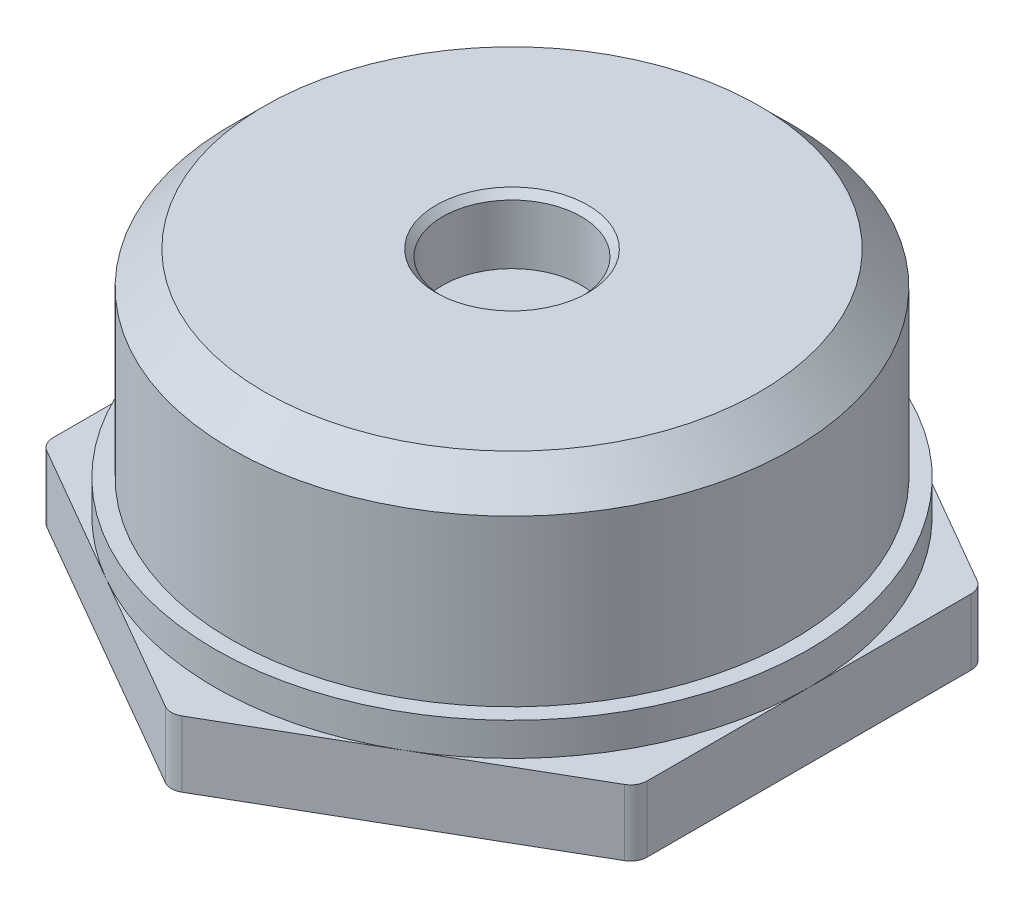
ISO-10303-21;
HEADER;
FILE_DESCRIPTION(('STEP AP214'),'2;1');
FILE_NAME('part.step','',(''),(''),'','','');
FILE_SCHEMA(('AUTOMOTIVE_DESIGN { 1 0 10303 214 1 1 1 1 }'));
ENDSEC;
DATA;
#1=APPLICATION_CONTEXT('core data for automotive mechanical design processes');
#2=APPLICATION_PROTOCOL_DEFINITION('international standard','automotive_design',2000,#1);
#3=PRODUCT_CONTEXT('',#1,'mechanical');
#4=PRODUCT('Part','Part','',(#3));
#5=PRODUCT_RELATED_PRODUCT_CATEGORY('part','',(#4));
#6=PRODUCT_DEFINITION_FORMATION('','',#4);
#7=PRODUCT_DEFINITION_CONTEXT('part definition',#1,'design');
#8=PRODUCT_DEFINITION('design','',#6,#7);
#9=PRODUCT_DEFINITION_SHAPE('','',#8);
#10=(LENGTH_UNIT() NAMED_UNIT(*) SI_UNIT(.MILLI.,.METRE.));
#11=(NAMED_UNIT(*) PLANE_ANGLE_UNIT() SI_UNIT($,.RADIAN.));
#12=(NAMED_UNIT(*) SI_UNIT($,.STERADIAN.) SOLID_ANGLE_UNIT());
#13=UNCERTAINTY_MEASURE_WITH_UNIT(LENGTH_MEASURE(1.E-05),#10,'distance_accuracy_value','');
#14=(GEOMETRIC_REPRESENTATION_CONTEXT(3) GLOBAL_UNCERTAINTY_ASSIGNED_CONTEXT((#13)) GLOBAL_UNIT_ASSIGNED_CONTEXT((#10,
#11,#12)) REPRESENTATION_CONTEXT('',''));
#15=CARTESIAN_POINT('',(0.,0.,0.));
#16=DIRECTION('',(0.,0.,1.));
#17=DIRECTION('',(1.,0.,0.));
#18=AXIS2_PLACEMENT_3D('',#15,#16,#17);
#19=CARTESIAN_POINT('',(2.5,31.,-1.44337567297407));
#20=DIRECTION('',(0.5,0.,-0.866025403784439));
#21=DIRECTION('',(-0.866025403784439,0.,-0.5));
#22=AXIS2_PLACEMENT_3D('',#19,#20,#21);
#23=PLANE('',#22);
#24=DIRECTION('',(0.866025403784439,0.,0.5));
#25=VECTOR('',#24,1.);
#26=CARTESIAN_POINT('',(2.5,37.,-1.44337567297407));
#27=LINE('',#26,#25);
#28=CARTESIAN_POINT('',(0.,37.,-2.88675134594813));
#29=VERTEX_POINT('',#28);
#30=CARTESIAN_POINT('',(2.5,37.,-1.44337567297407));
#31=VERTEX_POINT('',#30);
#32=EDGE_CURVE('E207',#29,#31,#27,.T.);
#33=ORIENTED_EDGE('',*,*,#32,.F.);
#34=DIRECTION('',(0.,1.,0.));
#35=VECTOR('',#34,1.);
#36=CARTESIAN_POINT('',(0.,31.,-2.88675134594813));
#37=LINE('',#36,#35);
#38=CARTESIAN_POINT('',(0.,31.,-2.88675134594813));
#39=VERTEX_POINT('',#38);
#40=EDGE_CURVE('E191',#39,#29,#37,.T.);
#41=ORIENTED_EDGE('',*,*,#40,.F.);
#42=DIRECTION('',(-0.866025403784439,0.,-0.5));
#43=VECTOR('',#42,1.);
#44=CARTESIAN_POINT('',(2.5,31.,-1.44337567297407));
#45=LINE('',#44,#43);
#46=CARTESIAN_POINT('',(2.5,31.,-1.44337567297407));
#47=VERTEX_POINT('',#46);
#48=EDGE_CURVE('E210',#47,#39,#45,.T.);
#49=ORIENTED_EDGE('',*,*,#48,.F.);
#50=DIRECTION('',(0.,1.,0.));
#51=VECTOR('',#50,1.);
#52=CARTESIAN_POINT('',(2.5,31.,-1.44337567297407));
#53=LINE('',#52,#51);
#54=EDGE_CURVE('E208',#47,#31,#53,.T.);
#55=ORIENTED_EDGE('',*,*,#54,.T.);
#56=EDGE_LOOP('',(#33,#41,#49,#55));
#57=FACE_BOUND('',#56,.T.);
#58=ADVANCED_FACE('F47',(#57),#23,.F.);
#59=CARTESIAN_POINT('',(2.5,31.,1.44337567297406));
#60=DIRECTION('',(1.,0.,0.));
#61=DIRECTION('',(0.,0.,-1.));
#62=AXIS2_PLACEMENT_3D('',#59,#60,#61);
#63=PLANE('',#62);
#64=DIRECTION('',(0.,0.,1.));
#65=VECTOR('',#64,1.);
#66=CARTESIAN_POINT('',(2.5,37.,1.44337567297406));
#67=LINE('',#66,#65);
#68=CARTESIAN_POINT('',(2.5,37.,1.44337567297406));
#69=VERTEX_POINT('',#68);
#70=EDGE_CURVE('E63',#31,#69,#67,.T.);
#71=ORIENTED_EDGE('',*,*,#70,.F.);
#72=ORIENTED_EDGE('',*,*,#54,.F.);
#73=DIRECTION('',(0.,0.,-1.));
#74=VECTOR('',#73,1.);
#75=CARTESIAN_POINT('',(2.5,31.,1.44337567297406));
#76=LINE('',#75,#74);
#77=CARTESIAN_POINT('',(2.5,31.,1.44337567297406));
#78=VERTEX_POINT('',#77);
#79=EDGE_CURVE('E204',#78,#47,#76,.T.);
#80=ORIENTED_EDGE('',*,*,#79,.F.);
#81=DIRECTION('',(0.,1.,0.));
#82=VECTOR('',#81,1.);
#83=CARTESIAN_POINT('',(2.5,31.,1.44337567297406));
#84=LINE('',#83,#82);
#85=EDGE_CURVE('E755',#78,#69,#84,.T.);
#86=ORIENTED_EDGE('',*,*,#85,.T.);
#87=EDGE_LOOP('',(#71,#72,#80,#86));
#88=FACE_BOUND('',#87,.T.);
#89=ADVANCED_FACE('F247',(#88),#63,.F.);
#90=CARTESIAN_POINT('',(0.,31.,2.88675134594813));
#91=DIRECTION('',(0.5,0.,0.866025403784439));
#92=DIRECTION('',(0.866025403784439,0.,-0.5));
#93=AXIS2_PLACEMENT_3D('',#90,#91,#92);
#94=PLANE('',#93);
#95=DIRECTION('',(-0.866025403784439,0.,0.5));
#96=VECTOR('',#95,1.);
#97=CARTESIAN_POINT('',(0.,37.,2.88675134594813));
#98=LINE('',#97,#96);
#99=CARTESIAN_POINT('',(0.,37.,2.88675134594813));
#100=VERTEX_POINT('',#99);
#101=EDGE_CURVE('E71',#69,#100,#98,.T.);
#102=ORIENTED_EDGE('',*,*,#101,.F.);
#103=ORIENTED_EDGE('',*,*,#85,.F.);
#104=DIRECTION('',(0.866025403784439,0.,-0.5));
#105=VECTOR('',#104,1.);
#106=CARTESIAN_POINT('',(0.,31.,2.88675134594813));
#107=LINE('',#106,#105);
#108=CARTESIAN_POINT('',(0.,31.,2.88675134594813));
#109=VERTEX_POINT('',#108);
#110=EDGE_CURVE('E749',#109,#78,#107,.T.);
#111=ORIENTED_EDGE('',*,*,#110,.F.);
#112=DIRECTION('',(0.,1.,0.));
#113=VECTOR('',#112,1.);
#114=CARTESIAN_POINT('',(0.,31.,2.88675134594813));
#115=LINE('',#114,#113);
#116=EDGE_CURVE('E737',#109,#100,#115,.T.);
#117=ORIENTED_EDGE('',*,*,#116,.T.);
#118=EDGE_LOOP('',(#102,#103,#111,#117));
#119=FACE_BOUND('',#118,.T.);
#120=ADVANCED_FACE('F253',(#119),#94,.F.);
#121=CARTESIAN_POINT('',(-2.5,31.,1.44337567297407));
#122=DIRECTION('',(-0.5,0.,0.866025403784439));
#123=DIRECTION('',(0.866025403784439,0.,0.5));
#124=AXIS2_PLACEMENT_3D('',#121,#122,#123);
#125=PLANE('',#124);
#126=DIRECTION('',(-0.866025403784439,0.,-0.5));
#127=VECTOR('',#126,1.);
#128=CARTESIAN_POINT('',(-2.5,37.,1.44337567297407));
#129=LINE('',#128,#127);
#130=CARTESIAN_POINT('',(-2.5,37.,1.44337567297407));
#131=VERTEX_POINT('',#130);
#132=EDGE_CURVE('E731',#100,#131,#129,.T.);
#133=ORIENTED_EDGE('',*,*,#132,.F.);
#134=ORIENTED_EDGE('',*,*,#116,.F.);
#135=DIRECTION('',(0.866025403784439,0.,0.5));
#136=VECTOR('',#135,1.);
#137=CARTESIAN_POINT('',(-2.5,31.,1.44337567297407));
#138=LINE('',#137,#136);
#139=CARTESIAN_POINT('',(-2.5,31.,1.44337567297407));
#140=VERTEX_POINT('',#139);
#141=EDGE_CURVE('E735',#140,#109,#138,.T.);
#142=ORIENTED_EDGE('',*,*,#141,.F.);
#143=DIRECTION('',(0.,1.,0.));
#144=VECTOR('',#143,1.);
#145=CARTESIAN_POINT('',(-2.5,31.,1.44337567297407));
#146=LINE('',#145,#144);
#147=EDGE_CURVE('E729',#140,#131,#146,.T.);
#148=ORIENTED_EDGE('',*,*,#147,.T.);
#149=EDGE_LOOP('',(#133,#134,#142,#148));
#150=FACE_BOUND('',#149,.T.);
#151=ADVANCED_FACE('F522',(#150),#125,.F.);
#152=CARTESIAN_POINT('',(-2.5,31.,-1.44337567297406));
#153=DIRECTION('',(-1.,0.,0.));
#154=DIRECTION('',(0.,0.,1.));
#155=AXIS2_PLACEMENT_3D('',#152,#153,#154);
#156=PLANE('',#155);
#157=DIRECTION('',(0.,0.,-1.));
#158=VECTOR('',#157,1.);
#159=CARTESIAN_POINT('',(-2.5,37.,-1.44337567297406));
#160=LINE('',#159,#158);
#161=CARTESIAN_POINT('',(-2.5,37.,-1.44337567297406));
#162=VERTEX_POINT('',#161);
#163=EDGE_CURVE('E215',#131,#162,#160,.T.);
#164=ORIENTED_EDGE('',*,*,#163,.F.);
#165=ORIENTED_EDGE('',*,*,#147,.F.);
#166=DIRECTION('',(0.,0.,1.));
#167=VECTOR('',#166,1.);
#168=CARTESIAN_POINT('',(-2.5,31.,-1.44337567297406));
#169=LINE('',#168,#167);
#170=CARTESIAN_POINT('',(-2.5,31.,-1.44337567297406));
#171=VERTEX_POINT('',#170);
#172=EDGE_CURVE('E746',#171,#140,#169,.T.);
#173=ORIENTED_EDGE('',*,*,#172,.F.);
#174=DIRECTION('',(0.,1.,0.));
#175=VECTOR('',#174,1.);
#176=CARTESIAN_POINT('',(-2.5,31.,-1.44337567297406));
#177=LINE('',#176,#175);
#178=EDGE_CURVE('E203',#171,#162,#177,.T.);
#179=ORIENTED_EDGE('',*,*,#178,.T.);
#180=EDGE_LOOP('',(#164,#165,#173,#179));
#181=FACE_BOUND('',#180,.T.);
#182=ADVANCED_FACE('F517',(#181),#156,.F.);
#183=CARTESIAN_POINT('',(0.,31.,-2.88675134594813));
#184=DIRECTION('',(-0.5,0.,-0.866025403784439));
#185=DIRECTION('',(-0.866025403784439,0.,0.5));
#186=AXIS2_PLACEMENT_3D('',#183,#184,#185);
#187=PLANE('',#186);
#188=DIRECTION('',(0.866025403784439,0.,-0.5));
#189=VECTOR('',#188,1.);
#190=CARTESIAN_POINT('',(0.,37.,-2.88675134594813));
#191=LINE('',#190,#189);
#192=EDGE_CURVE('E196',#162,#29,#191,.T.);
#193=ORIENTED_EDGE('',*,*,#192,.F.);
#194=ORIENTED_EDGE('',*,*,#178,.F.);
#195=DIRECTION('',(-0.866025403784439,0.,0.5));
#196=VECTOR('',#195,1.);
#197=CARTESIAN_POINT('',(0.,31.,-2.88675134594813));
#198=LINE('',#197,#196);
#199=EDGE_CURVE('E199',#39,#171,#198,.T.);
#200=ORIENTED_EDGE('',*,*,#199,.F.);
#201=ORIENTED_EDGE('',*,*,#40,.T.);
#202=EDGE_LOOP('',(#193,#194,#200,#201));
#203=FACE_BOUND('',#202,.T.);
#204=ADVANCED_FACE('F193',(#203),#187,.F.);
#205=CARTESIAN_POINT('',(0.,33.,0.));
#206=DIRECTION('',(0.,1.,0.));
#207=DIRECTION('',(0.,0.,1.));
#208=AXIS2_PLACEMENT_3D('',#205,#206,#207);
#209=PLANE('',#208);
#210=CARTESIAN_POINT('',(0.,33.,0.));
#211=DIRECTION('',(0.,1.,0.));
#212=DIRECTION('',(0.,0.,1.));
#213=AXIS2_PLACEMENT_3D('',#210,#211,#212);
#214=CIRCLE('',#213,9.00000000000006);
#215=CARTESIAN_POINT('',(4.50000000000009,33.,7.79422863405996));
#216=VERTEX_POINT('',#215);
#217=CARTESIAN_POINT('',(8.99999999999999,33.,0.));
#218=VERTEX_POINT('',#217);
#219=EDGE_CURVE('E350',#216,#218,#214,.T.);
#220=ORIENTED_EDGE('',*,*,#219,.F.);
#221=DIRECTION('',(0.866025403784435,0.,-0.500000000000007));
#222=VECTOR('',#221,1.);
#223=CARTESIAN_POINT('',(0.,33.,10.3923048454133));
#224=LINE('',#223,#222);
#225=CARTESIAN_POINT('',(8.75000000000004,33.,5.34048999000395));
#226=VERTEX_POINT('',#225);
#227=EDGE_CURVE('E375',#216,#226,#224,.T.);
#228=ORIENTED_EDGE('',*,*,#227,.T.);
#229=CARTESIAN_POINT('',(8.50000000000004,33.,4.90747728811174));
#230=DIRECTION('',(0.,1.,0.));
#231=DIRECTION('',(0.,0.,1.));
#232=AXIS2_PLACEMENT_3D('',#229,#230,#231);
#233=CIRCLE('',#232,0.5);
#234=CARTESIAN_POINT('',(9.00000000000004,33.,4.90747728811173));
#235=VERTEX_POINT('',#234);
#236=EDGE_CURVE('E422',#226,#235,#233,.T.);
#237=ORIENTED_EDGE('',*,*,#236,.T.);
#238=DIRECTION('',(0.,0.,-1.));
#239=VECTOR('',#238,1.);
#240=CARTESIAN_POINT('',(9.00000000000004,33.,5.19615242270655));
#241=LINE('',#240,#239);
#242=EDGE_CURVE('E379',#235,#218,#241,.T.);
#243=ORIENTED_EDGE('',*,*,#242,.T.);
#244=EDGE_LOOP('',(#220,#228,#237,#243));
#245=FACE_BOUND('',#244,.T.);
#246=ADVANCED_FACE('F277',(#245),#209,.T.);
#247=CARTESIAN_POINT('',(4.49999999999997,33.,-7.79422863406));
#248=VERTEX_POINT('',#247);
#249=EDGE_CURVE('E223',#218,#248,#214,.T.);
#250=ORIENTED_EDGE('',*,*,#249,.F.);
#251=CARTESIAN_POINT('',(8.99999999999994,33.,-4.90747728811192));
#252=VERTEX_POINT('',#251);
#253=EDGE_CURVE('E378',#218,#252,#241,.T.);
#254=ORIENTED_EDGE('',*,*,#253,.T.);
#255=CARTESIAN_POINT('',(8.49999999999994,33.,-4.90747728811192));
#256=DIRECTION('',(0.,1.,0.));
#257=DIRECTION('',(0.,0.,1.));
#258=AXIS2_PLACEMENT_3D('',#255,#256,#257);
#259=CIRCLE('',#258,0.5);
#260=CARTESIAN_POINT('',(8.74999999999993,33.,-5.34048999000414));
#261=VERTEX_POINT('',#260);
#262=EDGE_CURVE('E420',#252,#261,#259,.T.);
#263=ORIENTED_EDGE('',*,*,#262,.T.);
#264=DIRECTION('',(-0.866025403784441,0.,-0.499999999999995));
#265=VECTOR('',#264,1.);
#266=CARTESIAN_POINT('',(8.99999999999993,33.,-5.19615242270673));
#267=LINE('',#266,#265);
#268=EDGE_CURVE('E359',#261,#248,#267,.T.);
#269=ORIENTED_EDGE('',*,*,#268,.T.);
#270=EDGE_LOOP('',(#250,#254,#263,#269));
#271=FACE_BOUND('',#270,.T.);
#272=ADVANCED_FACE('F469',(#271),#209,.T.);
#273=CARTESIAN_POINT('',(-4.50000000000001,33.,-7.79422863405994));
#274=VERTEX_POINT('',#273);
#275=EDGE_CURVE('E464',#248,#274,#214,.T.);
#276=ORIENTED_EDGE('',*,*,#275,.F.);
#277=CARTESIAN_POINT('',(0.25,33.,-10.2479672781159));
#278=VERTEX_POINT('',#277);
#279=EDGE_CURVE('E363',#248,#278,#267,.T.);
#280=ORIENTED_EDGE('',*,*,#279,.T.);
#281=CARTESIAN_POINT('',(0.,33.,-9.81495457622364));
#282=DIRECTION('',(0.,1.,0.));
#283=DIRECTION('',(0.,0.,1.));
#284=AXIS2_PLACEMENT_3D('',#281,#282,#283);
#285=CIRCLE('',#284,0.5);
#286=CARTESIAN_POINT('',(-0.249999999999997,33.,-10.2479672781159));
#287=VERTEX_POINT('',#286);
#288=EDGE_CURVE('E430',#278,#287,#285,.T.);
#289=ORIENTED_EDGE('',*,*,#288,.T.);
#290=DIRECTION('',(-0.866025403784438,0.,0.500000000000001));
#291=VECTOR('',#290,1.);
#292=CARTESIAN_POINT('',(0.,33.,-10.3923048454133));
#293=LINE('',#292,#291);
#294=EDGE_CURVE('E364',#287,#274,#293,.T.);
#295=ORIENTED_EDGE('',*,*,#294,.T.);
#296=EDGE_LOOP('',(#276,#280,#289,#295));
#297=FACE_BOUND('',#296,.T.);
#298=ADVANCED_FACE('F503',(#297),#209,.T.);
#299=CARTESIAN_POINT('',(-8.99999999999999,33.,0.));
#300=VERTEX_POINT('',#299);
#301=EDGE_CURVE('E462',#274,#300,#214,.T.);
#302=ORIENTED_EDGE('',*,*,#301,.F.);
#303=CARTESIAN_POINT('',(-8.75000000000001,33.,-5.34048999000402));
#304=VERTEX_POINT('',#303);
#305=EDGE_CURVE('E362',#274,#304,#293,.T.);
#306=ORIENTED_EDGE('',*,*,#305,.T.);
#307=CARTESIAN_POINT('',(-8.50000000000001,33.,-4.9074772881118));
#308=DIRECTION('',(0.,1.,0.));
#309=DIRECTION('',(0.,0.,1.));
#310=AXIS2_PLACEMENT_3D('',#307,#308,#309);
#311=CIRCLE('',#310,0.5);
#312=CARTESIAN_POINT('',(-9.00000000000001,33.,-4.90747728811179));
#313=VERTEX_POINT('',#312);
#314=EDGE_CURVE('E428',#304,#313,#311,.T.);
#315=ORIENTED_EDGE('',*,*,#314,.T.);
#316=DIRECTION('',(0.,0.,1.));
#317=VECTOR('',#316,1.);
#318=CARTESIAN_POINT('',(-9.00000000000001,33.,-5.19615242270661));
#319=LINE('',#318,#317);
#320=EDGE_CURVE('E368',#313,#300,#319,.T.);
#321=ORIENTED_EDGE('',*,*,#320,.T.);
#322=EDGE_LOOP('',(#302,#306,#315,#321));
#323=FACE_BOUND('',#322,.T.);
#324=ADVANCED_FACE('F505',(#323),#209,.T.);
#325=CARTESIAN_POINT('',(-4.49999999999995,33.,7.79422863405997));
#326=VERTEX_POINT('',#325);
#327=EDGE_CURVE('E459',#300,#326,#214,.T.);
#328=ORIENTED_EDGE('',*,*,#327,.F.);
#329=CARTESIAN_POINT('',(-8.99999999999998,33.,4.90747728811186));
#330=VERTEX_POINT('',#329);
#331=EDGE_CURVE('E367',#300,#330,#319,.T.);
#332=ORIENTED_EDGE('',*,*,#331,.T.);
#333=CARTESIAN_POINT('',(-8.49999999999998,33.,4.90747728811186));
#334=DIRECTION('',(0.,1.,0.));
#335=DIRECTION('',(0.,0.,1.));
#336=AXIS2_PLACEMENT_3D('',#333,#334,#335);
#337=CIRCLE('',#336,0.5);
#338=CARTESIAN_POINT('',(-8.74999999999997,33.,5.34048999000408));
#339=VERTEX_POINT('',#338);
#340=EDGE_CURVE('E426',#330,#339,#337,.T.);
#341=ORIENTED_EDGE('',*,*,#340,.T.);
#342=DIRECTION('',(0.866025403784442,0.,0.499999999999995));
#343=VECTOR('',#342,1.);
#344=CARTESIAN_POINT('',(-8.99999999999997,33.,5.19615242270667));
#345=LINE('',#344,#343);
#346=EDGE_CURVE('E372',#339,#326,#345,.T.);
#347=ORIENTED_EDGE('',*,*,#346,.T.);
#348=EDGE_LOOP('',(#328,#332,#341,#347));
#349=FACE_BOUND('',#348,.T.);
#350=ADVANCED_FACE('F278',(#349),#209,.T.);
#351=CARTESIAN_POINT('',(8.99999999999993,33.,-5.19615242270673));
#352=DIRECTION('',(-0.499999999999995,0.,0.866025403784441));
#353=DIRECTION('',(0.866025403784442,0.,0.499999999999995));
#354=AXIS2_PLACEMENT_3D('',#351,#352,#353);
#355=PLANE('',#354);
#356=DIRECTION('',(-0.866025403784441,0.,-0.499999999999995));
#357=VECTOR('',#356,1.);
#358=CARTESIAN_POINT('',(8.99999999999993,31.,-5.19615242270673));
#359=LINE('',#358,#357);
#360=CARTESIAN_POINT('',(8.74999999999993,31.,-5.34048999000414));
#361=VERTEX_POINT('',#360);
#362=CARTESIAN_POINT('',(0.25,31.,-10.2479672781159));
#363=VERTEX_POINT('',#362);
#364=EDGE_CURVE('E349',#361,#363,#359,.T.);
#365=ORIENTED_EDGE('',*,*,#364,.T.);
#366=DIRECTION('',(0.,-1.,0.));
#367=VECTOR('',#366,1.);
#368=CARTESIAN_POINT('',(0.25,33.,-10.2479672781159));
#369=LINE('',#368,#367);
#370=EDGE_CURVE('E417',#363,#278,#369,.F.);
#371=ORIENTED_EDGE('',*,*,#370,.T.);
#372=ORIENTED_EDGE('',*,*,#279,.F.);
#373=ORIENTED_EDGE('',*,*,#268,.F.);
#374=DIRECTION('',(0.,-1.,0.));
#375=VECTOR('',#374,1.);
#376=CARTESIAN_POINT('',(8.74999999999993,33.,-5.34048999000414));
#377=LINE('',#376,#375);
#378=EDGE_CURVE('E414',#261,#361,#377,.T.);
#379=ORIENTED_EDGE('',*,*,#378,.T.);
#380=EDGE_LOOP('',(#365,#371,#372,#373,#379));
#381=FACE_BOUND('',#380,.T.);
#382=ADVANCED_FACE('F300',(#381),#355,.F.);
#383=CARTESIAN_POINT('',(0.,33.,-10.3923048454133));
#384=DIRECTION('',(0.500000000000001,0.,0.866025403784438));
#385=DIRECTION('',(0.866025403784438,0.,-0.500000000000001));
#386=AXIS2_PLACEMENT_3D('',#383,#384,#385);
#387=PLANE('',#386);
#388=ORIENTED_EDGE('',*,*,#294,.F.);
#389=DIRECTION('',(0.,-1.,0.));
#390=VECTOR('',#389,1.);
#391=CARTESIAN_POINT('',(-0.249999999999997,33.,-10.2479672781159));
#392=LINE('',#391,#390);
#393=CARTESIAN_POINT('',(-0.249999999999997,31.,-10.2479672781159));
#394=VERTEX_POINT('',#393);
#395=EDGE_CURVE('E399',#287,#394,#392,.T.);
#396=ORIENTED_EDGE('',*,*,#395,.T.);
#397=DIRECTION('',(-0.866025403784438,0.,0.500000000000001));
#398=VECTOR('',#397,1.);
#399=CARTESIAN_POINT('',(0.,31.,-10.3923048454133));
#400=LINE('',#399,#398);
#401=CARTESIAN_POINT('',(-8.75000000000001,31.,-5.34048999000402));
#402=VERTEX_POINT('',#401);
#403=EDGE_CURVE('E353',#394,#402,#400,.T.);
#404=ORIENTED_EDGE('',*,*,#403,.T.);
#405=DIRECTION('',(0.,-1.,0.));
#406=VECTOR('',#405,1.);
#407=CARTESIAN_POINT('',(-8.75000000000001,33.,-5.34048999000402));
#408=LINE('',#407,#406);
#409=EDGE_CURVE('E381',#402,#304,#408,.F.);
#410=ORIENTED_EDGE('',*,*,#409,.T.);
#411=ORIENTED_EDGE('',*,*,#305,.F.);
#412=EDGE_LOOP('',(#388,#396,#404,#410,#411));
#413=FACE_BOUND('',#412,.T.);
#414=ADVANCED_FACE('F296',(#413),#387,.F.);
#415=CARTESIAN_POINT('',(-9.00000000000001,33.,-5.19615242270661));
#416=DIRECTION('',(1.,0.,0.));
#417=DIRECTION('',(0.,0.,-1.));
#418=AXIS2_PLACEMENT_3D('',#415,#416,#417);
#419=PLANE('',#418);
#420=ORIENTED_EDGE('',*,*,#320,.F.);
#421=DIRECTION('',(0.,-1.,0.));
#422=VECTOR('',#421,1.);
#423=CARTESIAN_POINT('',(-9.00000000000001,33.,-4.90747728811179));
#424=LINE('',#423,#422);
#425=CARTESIAN_POINT('',(-9.00000000000001,31.,-4.90747728811179));
#426=VERTEX_POINT('',#425);
#427=EDGE_CURVE('E435',#313,#426,#424,.T.);
#428=ORIENTED_EDGE('',*,*,#427,.T.);
#429=DIRECTION('',(0.,0.,1.));
#430=VECTOR('',#429,1.);
#431=CARTESIAN_POINT('',(-9.00000000000001,31.,-5.19615242270661));
#432=LINE('',#431,#430);
#433=CARTESIAN_POINT('',(-8.99999999999998,31.,4.90747728811186));
#434=VERTEX_POINT('',#433);
#435=EDGE_CURVE('E385',#426,#434,#432,.T.);
#436=ORIENTED_EDGE('',*,*,#435,.T.);
#437=DIRECTION('',(0.,-1.,0.));
#438=VECTOR('',#437,1.);
#439=CARTESIAN_POINT('',(-8.99999999999998,33.,4.90747728811186));
#440=LINE('',#439,#438);
#441=EDGE_CURVE('E432',#434,#330,#440,.F.);
#442=ORIENTED_EDGE('',*,*,#441,.T.);
#443=ORIENTED_EDGE('',*,*,#331,.F.);
#444=EDGE_LOOP('',(#420,#428,#436,#442,#443));
#445=FACE_BOUND('',#444,.T.);
#446=ADVANCED_FACE('F292',(#445),#419,.F.);
#447=CARTESIAN_POINT('',(-8.99999999999997,33.,5.19615242270667));
#448=DIRECTION('',(0.499999999999995,0.,-0.866025403784442));
#449=DIRECTION('',(-0.866025403784442,0.,-0.499999999999995));
#450=AXIS2_PLACEMENT_3D('',#447,#448,#449);
#451=PLANE('',#450);
#452=ORIENTED_EDGE('',*,*,#346,.F.);
#453=DIRECTION('',(0.,-1.,0.));
#454=VECTOR('',#453,1.);
#455=CARTESIAN_POINT('',(-8.74999999999997,33.,5.34048999000408));
#456=LINE('',#455,#454);
#457=CARTESIAN_POINT('',(-8.74999999999997,31.,5.34048999000408));
#458=VERTEX_POINT('',#457);
#459=EDGE_CURVE('E441',#339,#458,#456,.T.);
#460=ORIENTED_EDGE('',*,*,#459,.T.);
#461=DIRECTION('',(0.866025403784442,0.,0.499999999999995));
#462=VECTOR('',#461,1.);
#463=CARTESIAN_POINT('',(-8.99999999999997,31.,5.19615242270667));
#464=LINE('',#463,#462);
#465=CARTESIAN_POINT('',(-0.249999999999929,31.,10.2479672781159));
#466=VERTEX_POINT('',#465);
#467=EDGE_CURVE('E388',#458,#466,#464,.T.);
#468=ORIENTED_EDGE('',*,*,#467,.T.);
#469=DIRECTION('',(0.,-1.,0.));
#470=VECTOR('',#469,1.);
#471=CARTESIAN_POINT('',(-0.249999999999929,33.,10.2479672781159));
#472=LINE('',#471,#470);
#473=CARTESIAN_POINT('',(-0.249999999999929,33.,10.2479672781159));
#474=VERTEX_POINT('',#473);
#475=EDGE_CURVE('E438',#466,#474,#472,.F.);
#476=ORIENTED_EDGE('',*,*,#475,.T.);
#477=EDGE_CURVE('E371',#326,#474,#345,.T.);
#478=ORIENTED_EDGE('',*,*,#477,.F.);
#479=EDGE_LOOP('',(#452,#460,#468,#476,#478));
#480=FACE_BOUND('',#479,.T.);
#481=ADVANCED_FACE('F288',(#480),#451,.F.);
#482=CARTESIAN_POINT('',(0.,33.,10.3923048454133));
#483=DIRECTION('',(-0.500000000000007,0.,-0.866025403784435));
#484=DIRECTION('',(-0.866025403784435,0.,0.500000000000007));
#485=AXIS2_PLACEMENT_3D('',#482,#483,#484);
#486=PLANE('',#485);
#487=CARTESIAN_POINT('',(0.250000000000071,33.,10.2479672781158));
#488=VERTEX_POINT('',#487);
#489=EDGE_CURVE('E376',#488,#216,#224,.T.);
#490=ORIENTED_EDGE('',*,*,#489,.F.);
#491=DIRECTION('',(0.,-1.,0.));
#492=VECTOR('',#491,1.);
#493=CARTESIAN_POINT('',(0.250000000000071,33.,10.2479672781158));
#494=LINE('',#493,#492);
#495=CARTESIAN_POINT('',(0.250000000000071,31.,10.2479672781158));
#496=VERTEX_POINT('',#495);
#497=EDGE_CURVE('E447',#488,#496,#494,.T.);
#498=ORIENTED_EDGE('',*,*,#497,.T.);
#499=DIRECTION('',(0.866025403784435,0.,-0.500000000000007));
#500=VECTOR('',#499,1.);
#501=CARTESIAN_POINT('',(0.,31.,10.3923048454133));
#502=LINE('',#501,#500);
#503=CARTESIAN_POINT('',(8.75000000000004,31.,5.34048999000395));
#504=VERTEX_POINT('',#503);
#505=EDGE_CURVE('E391',#496,#504,#502,.T.);
#506=ORIENTED_EDGE('',*,*,#505,.T.);
#507=DIRECTION('',(0.,-1.,0.));
#508=VECTOR('',#507,1.);
#509=CARTESIAN_POINT('',(8.75000000000004,33.,5.34048999000395));
#510=LINE('',#509,#508);
#511=EDGE_CURVE('E444',#504,#226,#510,.F.);
#512=ORIENTED_EDGE('',*,*,#511,.T.);
#513=ORIENTED_EDGE('',*,*,#227,.F.);
#514=EDGE_LOOP('',(#490,#498,#506,#512,#513));
#515=FACE_BOUND('',#514,.T.);
#516=ADVANCED_FACE('F284',(#515),#486,.F.);
#517=CARTESIAN_POINT('',(9.00000000000004,33.,5.19615242270655));
#518=DIRECTION('',(-1.,0.,0.));
#519=DIRECTION('',(0.,0.,1.));
#520=AXIS2_PLACEMENT_3D('',#517,#518,#519);
#521=PLANE('',#520);
#522=ORIENTED_EDGE('',*,*,#242,.F.);
#523=DIRECTION('',(0.,-1.,0.));
#524=VECTOR('',#523,1.);
#525=CARTESIAN_POINT('',(9.00000000000004,33.,4.90747728811173));
#526=LINE('',#525,#524);
#527=CARTESIAN_POINT('',(9.00000000000004,31.,4.90747728811173));
#528=VERTEX_POINT('',#527);
#529=EDGE_CURVE('E226',#235,#528,#526,.T.);
#530=ORIENTED_EDGE('',*,*,#529,.T.);
#531=DIRECTION('',(0.,0.,-1.));
#532=VECTOR('',#531,1.);
#533=CARTESIAN_POINT('',(9.00000000000004,31.,5.19615242270655));
#534=LINE('',#533,#532);
#535=CARTESIAN_POINT('',(8.99999999999994,31.,-4.90747728811192));
#536=VERTEX_POINT('',#535);
#537=EDGE_CURVE('E394',#528,#536,#534,.T.);
#538=ORIENTED_EDGE('',*,*,#537,.T.);
#539=DIRECTION('',(0.,-1.,0.));
#540=VECTOR('',#539,1.);
#541=CARTESIAN_POINT('',(8.99999999999994,33.,-4.90747728811192));
#542=LINE('',#541,#540);
#543=EDGE_CURVE('E449',#536,#252,#542,.F.);
#544=ORIENTED_EDGE('',*,*,#543,.T.);
#545=ORIENTED_EDGE('',*,*,#253,.F.);
#546=EDGE_LOOP('',(#522,#530,#538,#544,#545));
#547=FACE_BOUND('',#546,.T.);
#548=ADVANCED_FACE('F275',(#547),#521,.F.);
#549=EDGE_CURVE('E357',#326,#216,#214,.T.);
#550=ORIENTED_EDGE('',*,*,#549,.F.);
#551=ORIENTED_EDGE('',*,*,#477,.T.);
#552=CARTESIAN_POINT('',(0.,33.,9.81495457622363));
#553=DIRECTION('',(0.,1.,0.));
#554=DIRECTION('',(0.,0.,1.));
#555=AXIS2_PLACEMENT_3D('',#552,#553,#554);
#556=CIRCLE('',#555,0.5);
#557=EDGE_CURVE('E424',#474,#488,#556,.T.);
#558=ORIENTED_EDGE('',*,*,#557,.T.);
#559=ORIENTED_EDGE('',*,*,#489,.T.);
#560=EDGE_LOOP('',(#550,#551,#558,#559));
#561=FACE_BOUND('',#560,.T.);
#562=ADVANCED_FACE('F271',(#561),#209,.T.);
#563=CARTESIAN_POINT('',(0.,31.,0.));
#564=DIRECTION('',(0.,1.,0.));
#565=DIRECTION('',(0.,0.,1.));
#566=AXIS2_PLACEMENT_3D('',#563,#564,#565);
#567=PLANE('',#566);
#568=ORIENTED_EDGE('',*,*,#79,.T.);
#569=ORIENTED_EDGE('',*,*,#48,.T.);
#570=ORIENTED_EDGE('',*,*,#199,.T.);
#571=ORIENTED_EDGE('',*,*,#172,.T.);
#572=ORIENTED_EDGE('',*,*,#141,.T.);
#573=ORIENTED_EDGE('',*,*,#110,.T.);
#574=EDGE_LOOP('',(#568,#569,#570,#571,#572,#573));
#575=FACE_BOUND('',#574,.T.);
#576=ORIENTED_EDGE('',*,*,#403,.F.);
#577=CARTESIAN_POINT('',(0.,31.,-9.81495457622364));
#578=DIRECTION('',(0.,1.,0.));
#579=DIRECTION('',(0.,0.,1.));
#580=AXIS2_PLACEMENT_3D('',#577,#578,#579);
#581=CIRCLE('',#580,0.5);
#582=EDGE_CURVE('E412',#394,#363,#581,.F.);
#583=ORIENTED_EDGE('',*,*,#582,.T.);
#584=ORIENTED_EDGE('',*,*,#364,.F.);
#585=CARTESIAN_POINT('',(8.49999999999994,31.,-4.90747728811192));
#586=DIRECTION('',(0.,1.,0.));
#587=DIRECTION('',(0.,0.,1.));
#588=AXIS2_PLACEMENT_3D('',#585,#586,#587);
#589=CIRCLE('',#588,0.5);
#590=EDGE_CURVE('E402',#361,#536,#589,.F.);
#591=ORIENTED_EDGE('',*,*,#590,.T.);
#592=ORIENTED_EDGE('',*,*,#537,.F.);
#593=CARTESIAN_POINT('',(8.50000000000004,31.,4.90747728811174));
#594=DIRECTION('',(0.,1.,0.));
#595=DIRECTION('',(0.,0.,1.));
#596=AXIS2_PLACEMENT_3D('',#593,#594,#595);
#597=CIRCLE('',#596,0.5);
#598=EDGE_CURVE('E404',#528,#504,#597,.F.);
#599=ORIENTED_EDGE('',*,*,#598,.T.);
#600=ORIENTED_EDGE('',*,*,#505,.F.);
#601=CARTESIAN_POINT('',(0.,31.,9.81495457622363));
#602=DIRECTION('',(0.,1.,0.));
#603=DIRECTION('',(0.,0.,1.));
#604=AXIS2_PLACEMENT_3D('',#601,#602,#603);
#605=CIRCLE('',#604,0.5);
#606=EDGE_CURVE('E406',#496,#466,#605,.F.);
#607=ORIENTED_EDGE('',*,*,#606,.T.);
#608=ORIENTED_EDGE('',*,*,#467,.F.);
#609=CARTESIAN_POINT('',(-8.49999999999998,31.,4.90747728811186));
#610=DIRECTION('',(0.,1.,0.));
#611=DIRECTION('',(0.,0.,1.));
#612=AXIS2_PLACEMENT_3D('',#609,#610,#611);
#613=CIRCLE('',#612,0.5);
#614=EDGE_CURVE('E408',#458,#434,#613,.F.);
#615=ORIENTED_EDGE('',*,*,#614,.T.);
#616=ORIENTED_EDGE('',*,*,#435,.F.);
#617=CARTESIAN_POINT('',(-8.50000000000001,31.,-4.9074772881118));
#618=DIRECTION('',(0.,1.,0.));
#619=DIRECTION('',(0.,0.,1.));
#620=AXIS2_PLACEMENT_3D('',#617,#618,#619);
#621=CIRCLE('',#620,0.5);
#622=EDGE_CURVE('E410',#426,#402,#621,.F.);
#623=ORIENTED_EDGE('',*,*,#622,.T.);
#624=EDGE_LOOP('',(#576,#583,#584,#591,#592,#599,#600,#607,#608,#615,#616,#623));
#625=FACE_BOUND('',#624,.T.);
#626=ADVANCED_FACE('F274',(#575,#625),#567,.F.);
#627=CARTESIAN_POINT('',(0.,33.,-9.81495457622364));
#628=DIRECTION('',(0.,-1.,0.));
#629=DIRECTION('',(0.,0.,-1.));
#630=AXIS2_PLACEMENT_3D('',#627,#628,#629);
#631=CYLINDRICAL_SURFACE('',#630,0.5);
#632=ORIENTED_EDGE('',*,*,#288,.F.);
#633=ORIENTED_EDGE('',*,*,#370,.F.);
#634=ORIENTED_EDGE('',*,*,#582,.F.);
#635=ORIENTED_EDGE('',*,*,#395,.F.);
#636=EDGE_LOOP('',(#632,#633,#634,#635));
#637=FACE_BOUND('',#636,.T.);
#638=ADVANCED_FACE('F280',(#637),#631,.T.);
#639=CARTESIAN_POINT('',(-8.50000000000001,33.,-4.9074772881118));
#640=DIRECTION('',(0.,-1.,0.));
#641=DIRECTION('',(0.,0.,-1.));
#642=AXIS2_PLACEMENT_3D('',#639,#640,#641);
#643=CYLINDRICAL_SURFACE('',#642,0.5);
#644=ORIENTED_EDGE('',*,*,#314,.F.);
#645=ORIENTED_EDGE('',*,*,#409,.F.);
#646=ORIENTED_EDGE('',*,*,#622,.F.);
#647=ORIENTED_EDGE('',*,*,#427,.F.);
#648=EDGE_LOOP('',(#644,#645,#646,#647));
#649=FACE_BOUND('',#648,.T.);
#650=ADVANCED_FACE('F307',(#649),#643,.T.);
#651=CARTESIAN_POINT('',(-8.49999999999998,33.,4.90747728811186));
#652=DIRECTION('',(0.,-1.,0.));
#653=DIRECTION('',(0.,0.,-1.));
#654=AXIS2_PLACEMENT_3D('',#651,#652,#653);
#655=CYLINDRICAL_SURFACE('',#654,0.5);
#656=ORIENTED_EDGE('',*,*,#340,.F.);
#657=ORIENTED_EDGE('',*,*,#441,.F.);
#658=ORIENTED_EDGE('',*,*,#614,.F.);
#659=ORIENTED_EDGE('',*,*,#459,.F.);
#660=EDGE_LOOP('',(#656,#657,#658,#659));
#661=FACE_BOUND('',#660,.T.);
#662=ADVANCED_FACE('F311',(#661),#655,.T.);
#663=CARTESIAN_POINT('',(0.,33.,9.81495457622363));
#664=DIRECTION('',(0.,-1.,0.));
#665=DIRECTION('',(0.,0.,-1.));
#666=AXIS2_PLACEMENT_3D('',#663,#664,#665);
#667=CYLINDRICAL_SURFACE('',#666,0.5);
#668=ORIENTED_EDGE('',*,*,#557,.F.);
#669=ORIENTED_EDGE('',*,*,#475,.F.);
#670=ORIENTED_EDGE('',*,*,#606,.F.);
#671=ORIENTED_EDGE('',*,*,#497,.F.);
#672=EDGE_LOOP('',(#668,#669,#670,#671));
#673=FACE_BOUND('',#672,.T.);
#674=ADVANCED_FACE('F315',(#673),#667,.T.);
#675=CARTESIAN_POINT('',(8.50000000000004,33.,4.90747728811174));
#676=DIRECTION('',(0.,-1.,0.));
#677=DIRECTION('',(0.,0.,-1.));
#678=AXIS2_PLACEMENT_3D('',#675,#676,#677);
#679=CYLINDRICAL_SURFACE('',#678,0.5);
#680=ORIENTED_EDGE('',*,*,#236,.F.);
#681=ORIENTED_EDGE('',*,*,#511,.F.);
#682=ORIENTED_EDGE('',*,*,#598,.F.);
#683=ORIENTED_EDGE('',*,*,#529,.F.);
#684=EDGE_LOOP('',(#680,#681,#682,#683));
#685=FACE_BOUND('',#684,.T.);
#686=ADVANCED_FACE('F319',(#685),#679,.T.);
#687=CARTESIAN_POINT('',(8.49999999999994,33.,-4.90747728811192));
#688=DIRECTION('',(0.,-1.,0.));
#689=DIRECTION('',(0.,0.,-1.));
#690=AXIS2_PLACEMENT_3D('',#687,#688,#689);
#691=CYLINDRICAL_SURFACE('',#690,0.5);
#692=ORIENTED_EDGE('',*,*,#262,.F.);
#693=ORIENTED_EDGE('',*,*,#543,.F.);
#694=ORIENTED_EDGE('',*,*,#590,.F.);
#695=ORIENTED_EDGE('',*,*,#378,.F.);
#696=EDGE_LOOP('',(#692,#693,#694,#695));
#697=FACE_BOUND('',#696,.T.);
#698=ADVANCED_FACE('F269',(#697),#691,.T.);
#699=CARTESIAN_POINT('',(0.,34.,0.));
#700=DIRECTION('',(0.,-1.,0.));
#701=DIRECTION('',(0.,0.,-1.));
#702=AXIS2_PLACEMENT_3D('',#699,#700,#701);
#703=CYLINDRICAL_SURFACE('',#702,9.00000000000006);
#704=CARTESIAN_POINT('',(0.,34.,0.));
#705=DIRECTION('',(0.,1.,0.));
#706=DIRECTION('',(0.,0.,1.));
#707=AXIS2_PLACEMENT_3D('',#704,#705,#706);
#708=CIRCLE('',#707,9.00000000000006);
#709=CARTESIAN_POINT('',(0.,34.,9.00000000000006));
#710=VERTEX_POINT('',#709);
#711=EDGE_CURVE('E348',#710,#710,#708,.T.);
#712=ORIENTED_EDGE('',*,*,#711,.F.);
#713=EDGE_LOOP('',(#712));
#714=FACE_BOUND('',#713,.T.);
#715=ORIENTED_EDGE('',*,*,#219,.T.);
#716=ORIENTED_EDGE('',*,*,#249,.T.);
#717=ORIENTED_EDGE('',*,*,#275,.T.);
#718=ORIENTED_EDGE('',*,*,#301,.T.);
#719=ORIENTED_EDGE('',*,*,#327,.T.);
#720=ORIENTED_EDGE('',*,*,#549,.T.);
#721=EDGE_LOOP('',(#715,#716,#717,#718,#719,#720));
#722=FACE_BOUND('',#721,.T.);
#723=ADVANCED_FACE('F265',(#714,#722),#703,.T.);
#724=CARTESIAN_POINT('',(0.,34.,0.));
#725=DIRECTION('',(0.,1.,0.));
#726=DIRECTION('',(0.,0.,1.));
#727=AXIS2_PLACEMENT_3D('',#724,#725,#726);
#728=PLANE('',#727);
#729=CARTESIAN_POINT('',(0.,34.,0.));
#730=DIRECTION('',(0.,1.,0.));
#731=DIRECTION('',(0.,0.,1.));
#732=AXIS2_PLACEMENT_3D('',#729,#730,#731);
#733=CIRCLE('',#732,8.5);
#734=CARTESIAN_POINT('',(0.,34.,8.5));
#735=VERTEX_POINT('',#734);
#736=EDGE_CURVE('E217',#735,#735,#733,.T.);
#737=ORIENTED_EDGE('',*,*,#736,.F.);
#738=EDGE_LOOP('',(#737));
#739=FACE_BOUND('',#738,.T.);
#740=ORIENTED_EDGE('',*,*,#711,.T.);
#741=EDGE_LOOP('',(#740));
#742=FACE_BOUND('',#741,.T.);
#743=ADVANCED_FACE('F261',(#739,#742),#728,.T.);
#744=CARTESIAN_POINT('',(0.,38.,0.));
#745=DIRECTION('',(0.,-1.,0.));
#746=DIRECTION('',(0.,0.,-1.));
#747=AXIS2_PLACEMENT_3D('',#744,#745,#746);
#748=CYLINDRICAL_SURFACE('',#747,8.5);
#749=CARTESIAN_POINT('',(0.,39.,0.));
#750=DIRECTION('',(0.,1.,0.));
#751=DIRECTION('',(0.,0.,1.));
#752=AXIS2_PLACEMENT_3D('',#749,#750,#751);
#753=CIRCLE('',#752,8.5);
#754=CARTESIAN_POINT('',(0.,39.,8.5));
#755=VERTEX_POINT('',#754);
#756=EDGE_CURVE('E220',#755,#755,#753,.F.);
#757=ORIENTED_EDGE('',*,*,#756,.T.);
#758=EDGE_LOOP('',(#757));
#759=FACE_BOUND('',#758,.T.);
#760=ORIENTED_EDGE('',*,*,#736,.T.);
#761=EDGE_LOOP('',(#760));
#762=FACE_BOUND('',#761,.T.);
#763=ADVANCED_FACE('F258',(#759,#762),#748,.T.);
#764=CARTESIAN_POINT('',(0.,37.,0.));
#765=DIRECTION('',(0.,1.,0.));
#766=DIRECTION('',(0.,0.,1.));
#767=AXIS2_PLACEMENT_3D('',#764,#765,#766);
#768=PLANE('',#767);
#769=ORIENTED_EDGE('',*,*,#192,.T.);
#770=ORIENTED_EDGE('',*,*,#32,.T.);
#771=ORIENTED_EDGE('',*,*,#70,.T.);
#772=ORIENTED_EDGE('',*,*,#101,.T.);
#773=ORIENTED_EDGE('',*,*,#132,.T.);
#774=ORIENTED_EDGE('',*,*,#163,.T.);
#775=EDGE_LOOP('',(#769,#770,#771,#772,#773,#774));
#776=FACE_BOUND('',#775,.T.);
#777=ADVANCED_FACE('F213',(#776),#768,.F.);
#778=CARTESIAN_POINT('',(0.,40.,0.));
#779=DIRECTION('',(0.,1.,0.));
#780=DIRECTION('',(0.,0.,1.));
#781=AXIS2_PLACEMENT_3D('',#778,#779,#780);
#782=PLANE('',#781);
#783=CARTESIAN_POINT('',(0.,40.,0.));
#784=DIRECTION('',(0.,1.,0.));
#785=DIRECTION('',(0.,0.,1.));
#786=AXIS2_PLACEMENT_3D('',#783,#784,#785);
#787=CIRCLE('',#786,2.3);
#788=CARTESIAN_POINT('',(0.,40.,2.3));
#789=VERTEX_POINT('',#788);
#790=EDGE_CURVE('E11',#789,#789,#787,.F.);
#791=ORIENTED_EDGE('',*,*,#790,.T.);
#792=EDGE_LOOP('',(#791));
#793=FACE_BOUND('',#792,.T.);
#794=CARTESIAN_POINT('',(0.,40.,0.));
#795=DIRECTION('',(0.,1.,0.));
#796=DIRECTION('',(0.,0.,1.));
#797=AXIS2_PLACEMENT_3D('',#794,#795,#796);
#798=CIRCLE('',#797,7.5);
#799=CARTESIAN_POINT('',(0.,40.,7.5));
#800=VERTEX_POINT('',#799);
#801=EDGE_CURVE('E216',#800,#800,#798,.T.);
#802=ORIENTED_EDGE('',*,*,#801,.T.);
#803=EDGE_LOOP('',(#802));
#804=FACE_BOUND('',#803,.T.);
#805=ADVANCED_FACE('F331',(#793,#804),#782,.T.);
#806=CARTESIAN_POINT('',(0.,40.,0.));
#807=DIRECTION('',(0.,-1.,0.));
#808=DIRECTION('',(0.,0.,-1.));
#809=AXIS2_PLACEMENT_3D('',#806,#807,#808);
#810=CONICAL_SURFACE('',#809,7.5,0.785398163397447);
#811=ORIENTED_EDGE('',*,*,#756,.F.);
#812=EDGE_LOOP('',(#811));
#813=FACE_BOUND('',#812,.T.);
#814=ORIENTED_EDGE('',*,*,#801,.F.);
#815=EDGE_LOOP('',(#814));
#816=FACE_BOUND('',#815,.T.);
#817=ADVANCED_FACE('F327',(#813,#816),#810,.T.);
#818=CARTESIAN_POINT('',(0.,38.,0.));
#819=DIRECTION('',(0.,1.,0.));
#820=DIRECTION('',(0.,0.,1.));
#821=AXIS2_PLACEMENT_3D('',#818,#819,#820);
#822=CYLINDRICAL_SURFACE('',#821,2.1);
#823=CARTESIAN_POINT('',(0.,39.8,0.));
#824=DIRECTION('',(0.,1.,0.));
#825=DIRECTION('',(0.,0.,1.));
#826=AXIS2_PLACEMENT_3D('',#823,#824,#825);
#827=CIRCLE('',#826,2.1);
#828=CARTESIAN_POINT('',(0.,39.8,2.1));
#829=VERTEX_POINT('',#828);
#830=EDGE_CURVE('E56',#829,#829,#827,.T.);
#831=ORIENTED_EDGE('',*,*,#830,.T.);
#832=EDGE_LOOP('',(#831));
#833=FACE_BOUND('',#832,.T.);
#834=CARTESIAN_POINT('',(0.,38.,0.));
#835=DIRECTION('',(0.,1.,0.));
#836=DIRECTION('',(0.,0.,1.));
#837=AXIS2_PLACEMENT_3D('',#834,#835,#836);
#838=CIRCLE('',#837,2.1);
#839=CARTESIAN_POINT('',(0.,38.,2.1));
#840=VERTEX_POINT('',#839);
#841=EDGE_CURVE('E732',#840,#840,#838,.T.);
#842=ORIENTED_EDGE('',*,*,#841,.F.);
#843=EDGE_LOOP('',(#842));
#844=FACE_BOUND('',#843,.T.);
#845=ADVANCED_FACE('F233',(#833,#844),#822,.F.);
#846=CARTESIAN_POINT('',(0.,38.,0.));
#847=DIRECTION('',(0.,1.,0.));
#848=DIRECTION('',(0.,0.,1.));
#849=AXIS2_PLACEMENT_3D('',#846,#847,#848);
#850=PLANE('',#849);
#851=ORIENTED_EDGE('',*,*,#841,.T.);
#852=EDGE_LOOP('',(#851));
#853=FACE_BOUND('',#852,.T.);
#854=ADVANCED_FACE('F237',(#853),#850,.T.);
#855=CARTESIAN_POINT('',(0.,39.8,0.));
#856=DIRECTION('',(0.,1.,0.));
#857=DIRECTION('',(0.,0.,1.));
#858=AXIS2_PLACEMENT_3D('',#855,#856,#857);
#859=CONICAL_SURFACE('',#858,2.1,0.785398163397433);
#860=ORIENTED_EDGE('',*,*,#790,.F.);
#861=EDGE_LOOP('',(#860));
#862=FACE_BOUND('',#861,.T.);
#863=ORIENTED_EDGE('',*,*,#830,.F.);
#864=EDGE_LOOP('',(#863));
#865=FACE_BOUND('',#864,.T.);
#866=ADVANCED_FACE('F50',(#862,#865),#859,.F.);
#867=CLOSED_SHELL('',(#58,#89,#120,#151,#182,#204,#246,#272,#298,#324,#350,#382,#414,#446,#481,
#516,#548,#562,#626,#638,#650,#662,#674,#686,#698,#723,#743,#763,#777,#805,#817,#845,#854,#866));
#868=MANIFOLD_SOLID_BREP('B2',#867);
#869=ADVANCED_BREP_SHAPE_REPRESENTATION('',(#18,#868),#14);
#870=SHAPE_DEFINITION_REPRESENTATION(#9,#869);
ENDSEC;
END-ISO-10303-21;
